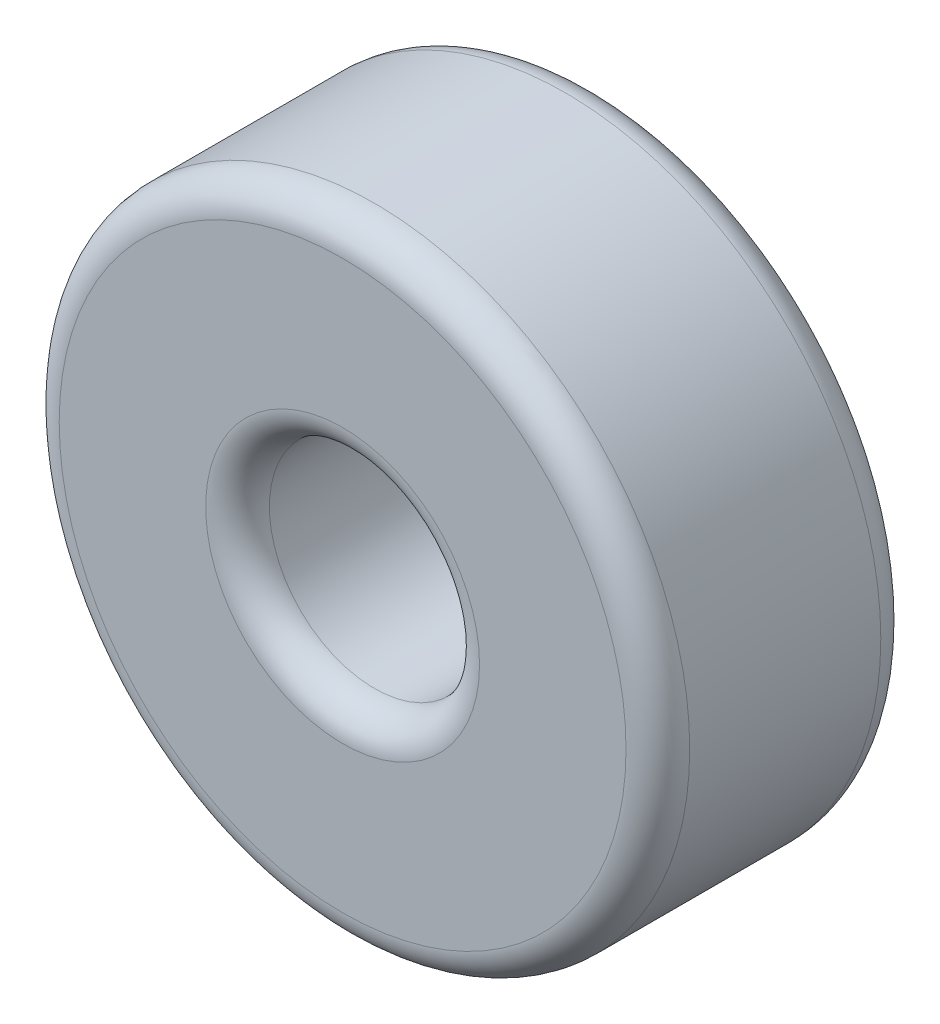
ISO-10303-21;
HEADER;
FILE_DESCRIPTION(('STEP AP214'),'2;1');
FILE_NAME('part.step','',(''),(''),'','','');
FILE_SCHEMA(('AUTOMOTIVE_DESIGN { 1 0 10303 214 1 1 1 1 }'));
ENDSEC;
DATA;
#1=APPLICATION_CONTEXT('core data for automotive mechanical design processes');
#2=APPLICATION_PROTOCOL_DEFINITION('international standard','automotive_design',2000,#1);
#3=PRODUCT_CONTEXT('',#1,'mechanical');
#4=PRODUCT('Part','Part','',(#3));
#5=PRODUCT_RELATED_PRODUCT_CATEGORY('part','',(#4));
#6=PRODUCT_DEFINITION_FORMATION('','',#4);
#7=PRODUCT_DEFINITION_CONTEXT('part definition',#1,'design');
#8=PRODUCT_DEFINITION('design','',#6,#7);
#9=PRODUCT_DEFINITION_SHAPE('','',#8);
#10=(LENGTH_UNIT() NAMED_UNIT(*) SI_UNIT(.MILLI.,.METRE.));
#11=(NAMED_UNIT(*) PLANE_ANGLE_UNIT() SI_UNIT($,.RADIAN.));
#12=(NAMED_UNIT(*) SI_UNIT($,.STERADIAN.) SOLID_ANGLE_UNIT());
#13=UNCERTAINTY_MEASURE_WITH_UNIT(LENGTH_MEASURE(1.E-05),#10,'distance_accuracy_value','');
#14=(GEOMETRIC_REPRESENTATION_CONTEXT(3) GLOBAL_UNCERTAINTY_ASSIGNED_CONTEXT((#13)) GLOBAL_UNIT_ASSIGNED_CONTEXT((#10,
#11,#12)) REPRESENTATION_CONTEXT('',''));
#15=CARTESIAN_POINT('',(0.,0.,0.));
#16=DIRECTION('',(0.,0.,1.));
#17=DIRECTION('',(1.,0.,0.));
#18=AXIS2_PLACEMENT_3D('',#15,#16,#17);
#19=CARTESIAN_POINT('',(0.,0.,4.));
#20=DIRECTION('',(0.,0.,1.));
#21=DIRECTION('',(1.,0.,0.));
#22=AXIS2_PLACEMENT_3D('',#19,#20,#21);
#23=PLANE('',#22);
#24=CARTESIAN_POINT('',(0.,0.,4.));
#25=DIRECTION('',(0.,0.,1.));
#26=DIRECTION('',(1.,0.,0.));
#27=AXIS2_PLACEMENT_3D('',#24,#25,#26);
#28=CIRCLE('',#27,2.15);
#29=CARTESIAN_POINT('',(2.15,0.,4.));
#30=VERTEX_POINT('',#29);
#31=EDGE_CURVE('E10',#30,#30,#28,.F.);
#32=ORIENTED_EDGE('',*,*,#31,.T.);
#33=EDGE_LOOP('',(#32));
#34=FACE_BOUND('',#33,.T.);
#35=CARTESIAN_POINT('',(0.,0.,4.));
#36=DIRECTION('',(0.,0.,1.));
#37=DIRECTION('',(1.,0.,0.));
#38=AXIS2_PLACEMENT_3D('',#35,#36,#37);
#39=CIRCLE('',#38,4.45);
#40=CARTESIAN_POINT('',(4.45,0.,4.));
#41=VERTEX_POINT('',#40);
#42=EDGE_CURVE('E38',#41,#41,#39,.T.);
#43=ORIENTED_EDGE('',*,*,#42,.T.);
#44=EDGE_LOOP('',(#43));
#45=FACE_BOUND('',#44,.T.);
#46=ADVANCED_FACE('F31',(#34,#45),#23,.T.);
#47=CARTESIAN_POINT('',(0.,0.,0.));
#48=DIRECTION('',(0.,0.,1.));
#49=DIRECTION('',(1.,0.,0.));
#50=AXIS2_PLACEMENT_3D('',#47,#48,#49);
#51=PLANE('',#50);
#52=CARTESIAN_POINT('',(0.,0.,0.));
#53=DIRECTION('',(0.,0.,1.));
#54=DIRECTION('',(1.,0.,0.));
#55=AXIS2_PLACEMENT_3D('',#52,#53,#54);
#56=CIRCLE('',#55,2.15);
#57=CARTESIAN_POINT('',(2.15,0.,0.));
#58=VERTEX_POINT('',#57);
#59=EDGE_CURVE('E57',#58,#58,#56,.T.);
#60=ORIENTED_EDGE('',*,*,#59,.T.);
#61=EDGE_LOOP('',(#60));
#62=FACE_BOUND('',#61,.T.);
#63=CARTESIAN_POINT('',(0.,0.,0.));
#64=DIRECTION('',(0.,0.,1.));
#65=DIRECTION('',(1.,0.,0.));
#66=AXIS2_PLACEMENT_3D('',#63,#64,#65);
#67=CIRCLE('',#66,4.45);
#68=CARTESIAN_POINT('',(4.45,0.,0.));
#69=VERTEX_POINT('',#68);
#70=EDGE_CURVE('E60',#69,#69,#67,.F.);
#71=ORIENTED_EDGE('',*,*,#70,.T.);
#72=EDGE_LOOP('',(#71));
#73=FACE_BOUND('',#72,.T.);
#74=ADVANCED_FACE('F64',(#62,#73),#51,.F.);
#75=CARTESIAN_POINT('',(0.,0.,4.));
#76=DIRECTION('',(0.,0.,-1.));
#77=DIRECTION('',(-1.,0.,0.));
#78=AXIS2_PLACEMENT_3D('',#75,#76,#77);
#79=CYLINDRICAL_SURFACE('',#78,4.95);
#80=CARTESIAN_POINT('',(0.,0.,0.5));
#81=DIRECTION('',(0.,0.,1.));
#82=DIRECTION('',(1.,0.,0.));
#83=AXIS2_PLACEMENT_3D('',#80,#81,#82);
#84=CIRCLE('',#83,4.95);
#85=CARTESIAN_POINT('',(4.95,0.,0.5));
#86=VERTEX_POINT('',#85);
#87=EDGE_CURVE('E42',#86,#86,#84,.T.);
#88=ORIENTED_EDGE('',*,*,#87,.T.);
#89=EDGE_LOOP('',(#88));
#90=FACE_BOUND('',#89,.T.);
#91=CARTESIAN_POINT('',(0.,0.,3.5));
#92=DIRECTION('',(0.,0.,1.));
#93=DIRECTION('',(1.,0.,0.));
#94=AXIS2_PLACEMENT_3D('',#91,#92,#93);
#95=CIRCLE('',#94,4.95);
#96=CARTESIAN_POINT('',(4.95,0.,3.5));
#97=VERTEX_POINT('',#96);
#98=EDGE_CURVE('E46',#97,#97,#95,.F.);
#99=ORIENTED_EDGE('',*,*,#98,.T.);
#100=EDGE_LOOP('',(#99));
#101=FACE_BOUND('',#100,.T.);
#102=ADVANCED_FACE('F74',(#90,#101),#79,.T.);
#103=CARTESIAN_POINT('',(0.,0.,4.));
#104=DIRECTION('',(0.,0.,-1.));
#105=DIRECTION('',(-1.,0.,0.));
#106=AXIS2_PLACEMENT_3D('',#103,#104,#105);
#107=CYLINDRICAL_SURFACE('',#106,1.65);
#108=CARTESIAN_POINT('',(0.,0.,0.5));
#109=DIRECTION('',(0.,0.,1.));
#110=DIRECTION('',(1.,0.,0.));
#111=AXIS2_PLACEMENT_3D('',#108,#109,#110);
#112=CIRCLE('',#111,1.65);
#113=CARTESIAN_POINT('',(1.65,0.,0.5));
#114=VERTEX_POINT('',#113);
#115=EDGE_CURVE('E51',#114,#114,#112,.F.);
#116=ORIENTED_EDGE('',*,*,#115,.T.);
#117=EDGE_LOOP('',(#116));
#118=FACE_BOUND('',#117,.T.);
#119=CARTESIAN_POINT('',(0.,0.,3.5));
#120=DIRECTION('',(0.,0.,1.));
#121=DIRECTION('',(1.,0.,0.));
#122=AXIS2_PLACEMENT_3D('',#119,#120,#121);
#123=CIRCLE('',#122,1.65);
#124=CARTESIAN_POINT('',(1.65,0.,3.5));
#125=VERTEX_POINT('',#124);
#126=EDGE_CURVE('E54',#125,#125,#123,.T.);
#127=ORIENTED_EDGE('',*,*,#126,.T.);
#128=EDGE_LOOP('',(#127));
#129=FACE_BOUND('',#128,.T.);
#130=ADVANCED_FACE('F77',(#118,#129),#107,.F.);
#131=CARTESIAN_POINT('',(0.,0.,0.5));
#132=DIRECTION('',(0.,0.,1.));
#133=DIRECTION('',(1.,0.,0.));
#134=AXIS2_PLACEMENT_3D('',#131,#132,#133);
#135=TOROIDAL_SURFACE('',#134,2.15,0.5);
#136=ORIENTED_EDGE('',*,*,#115,.F.);
#137=EDGE_LOOP('',(#136));
#138=FACE_BOUND('',#137,.T.);
#139=ORIENTED_EDGE('',*,*,#59,.F.);
#140=EDGE_LOOP('',(#139));
#141=FACE_BOUND('',#140,.T.);
#142=ADVANCED_FACE('F70',(#138,#141),#135,.T.);
#143=CARTESIAN_POINT('',(0.,0.,0.5));
#144=DIRECTION('',(0.,0.,1.));
#145=DIRECTION('',(1.,0.,0.));
#146=AXIS2_PLACEMENT_3D('',#143,#144,#145);
#147=TOROIDAL_SURFACE('',#146,4.45,0.5);
#148=ORIENTED_EDGE('',*,*,#70,.F.);
#149=EDGE_LOOP('',(#148));
#150=FACE_BOUND('',#149,.T.);
#151=ORIENTED_EDGE('',*,*,#87,.F.);
#152=EDGE_LOOP('',(#151));
#153=FACE_BOUND('',#152,.T.);
#154=ADVANCED_FACE('F66',(#150,#153),#147,.T.);
#155=CARTESIAN_POINT('',(0.,0.,3.5));
#156=DIRECTION('',(0.,0.,1.));
#157=DIRECTION('',(1.,0.,0.));
#158=AXIS2_PLACEMENT_3D('',#155,#156,#157);
#159=TOROIDAL_SURFACE('',#158,2.15,0.5);
#160=ORIENTED_EDGE('',*,*,#31,.F.);
#161=EDGE_LOOP('',(#160));
#162=FACE_BOUND('',#161,.T.);
#163=ORIENTED_EDGE('',*,*,#126,.F.);
#164=EDGE_LOOP('',(#163));
#165=FACE_BOUND('',#164,.T.);
#166=ADVANCED_FACE('F69',(#162,#165),#159,.T.);
#167=CARTESIAN_POINT('',(0.,0.,3.5));
#168=DIRECTION('',(0.,0.,1.));
#169=DIRECTION('',(1.,0.,0.));
#170=AXIS2_PLACEMENT_3D('',#167,#168,#169);
#171=TOROIDAL_SURFACE('',#170,4.45,0.5);
#172=ORIENTED_EDGE('',*,*,#98,.F.);
#173=EDGE_LOOP('',(#172));
#174=FACE_BOUND('',#173,.T.);
#175=ORIENTED_EDGE('',*,*,#42,.F.);
#176=EDGE_LOOP('',(#175));
#177=FACE_BOUND('',#176,.T.);
#178=ADVANCED_FACE('F33',(#174,#177),#171,.T.);
#179=CLOSED_SHELL('',(#46,#74,#102,#130,#142,#154,#166,#178));
#180=MANIFOLD_SOLID_BREP('B2',#179);
#181=ADVANCED_BREP_SHAPE_REPRESENTATION('',(#18,#180),#14);
#182=SHAPE_DEFINITION_REPRESENTATION(#9,#181);
ENDSEC;
END-ISO-10303-21;
